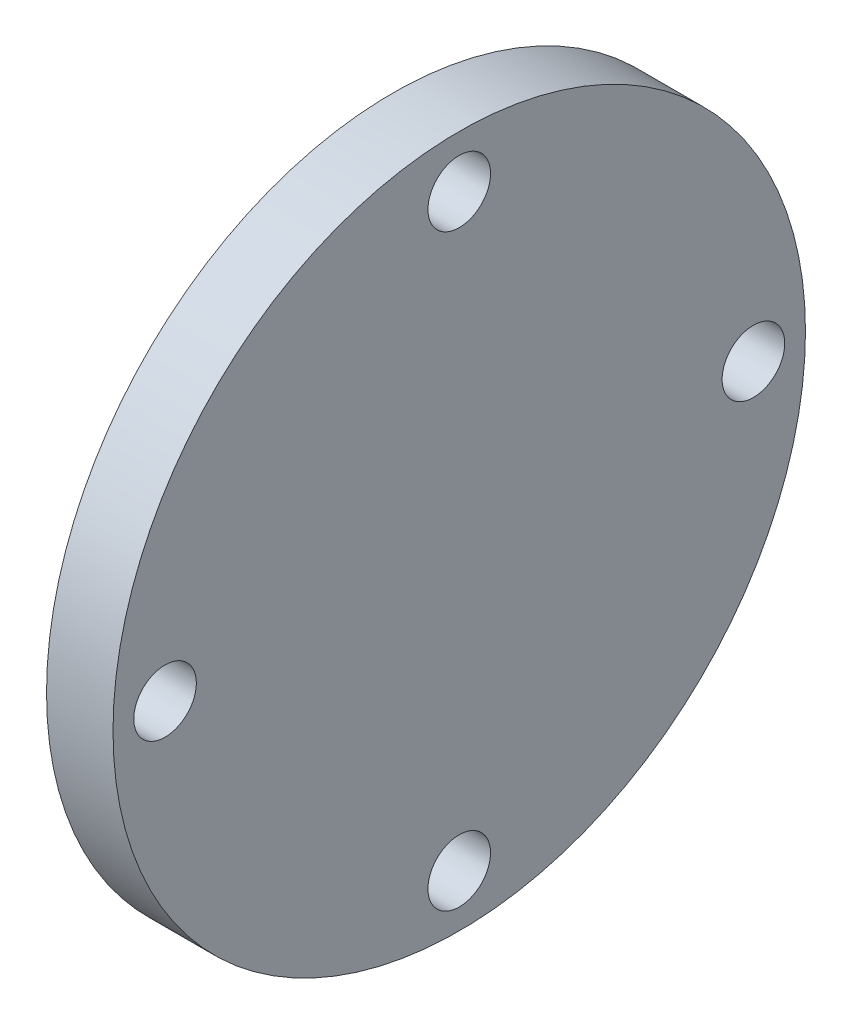
ISO-10303-21;
HEADER;
FILE_DESCRIPTION(('STEP AP214'),'2;1');
FILE_NAME('part.step','',(''),(''),'','','');
FILE_SCHEMA(('AUTOMOTIVE_DESIGN { 1 0 10303 214 1 1 1 1 }'));
ENDSEC;
DATA;
#1=APPLICATION_CONTEXT('core data for automotive mechanical design processes');
#2=APPLICATION_PROTOCOL_DEFINITION('international standard','automotive_design',2000,#1);
#3=PRODUCT_CONTEXT('',#1,'mechanical');
#4=PRODUCT('Part','Part','',(#3));
#5=PRODUCT_RELATED_PRODUCT_CATEGORY('part','',(#4));
#6=PRODUCT_DEFINITION_FORMATION('','',#4);
#7=PRODUCT_DEFINITION_CONTEXT('part definition',#1,'design');
#8=PRODUCT_DEFINITION('design','',#6,#7);
#9=PRODUCT_DEFINITION_SHAPE('','',#8);
#10=(LENGTH_UNIT() NAMED_UNIT(*) SI_UNIT(.MILLI.,.METRE.));
#11=(NAMED_UNIT(*) PLANE_ANGLE_UNIT() SI_UNIT($,.RADIAN.));
#12=(NAMED_UNIT(*) SI_UNIT($,.STERADIAN.) SOLID_ANGLE_UNIT());
#13=UNCERTAINTY_MEASURE_WITH_UNIT(LENGTH_MEASURE(1.E-05),#10,'distance_accuracy_value','');
#14=(GEOMETRIC_REPRESENTATION_CONTEXT(3) GLOBAL_UNCERTAINTY_ASSIGNED_CONTEXT((#13)) GLOBAL_UNIT_ASSIGNED_CONTEXT((#10,
#11,#12)) REPRESENTATION_CONTEXT('',''));
#15=CARTESIAN_POINT('',(0.,0.,0.));
#16=DIRECTION('',(0.,0.,1.));
#17=DIRECTION('',(1.,0.,0.));
#18=AXIS2_PLACEMENT_3D('',#15,#16,#17);
#19=CARTESIAN_POINT('',(0.,0.,0.));
#20=DIRECTION('',(1.,0.,0.));
#21=DIRECTION('',(0.,0.,-1.));
#22=AXIS2_PLACEMENT_3D('',#19,#20,#21);
#23=PLANE('',#22);
#24=CARTESIAN_POINT('',(0.,0.,13.4874));
#25=DIRECTION('',(1.,0.,0.));
#26=DIRECTION('',(0.,0.,-1.));
#27=AXIS2_PLACEMENT_3D('',#24,#25,#26);
#28=CIRCLE('',#27,1.4351);
#29=CARTESIAN_POINT('',(0.,0.,12.0523));
#30=VERTEX_POINT('',#29);
#31=EDGE_CURVE('E68',#30,#30,#28,.T.);
#32=ORIENTED_EDGE('',*,*,#31,.F.);
#33=EDGE_LOOP('',(#32));
#34=FACE_BOUND('',#33,.T.);
#35=CARTESIAN_POINT('',(0.,-13.4874,0.));
#36=DIRECTION('',(1.,0.,0.));
#37=DIRECTION('',(0.,0.,-1.));
#38=AXIS2_PLACEMENT_3D('',#35,#36,#37);
#39=CIRCLE('',#38,1.4351);
#40=CARTESIAN_POINT('',(0.,-13.4874,-1.4351));
#41=VERTEX_POINT('',#40);
#42=EDGE_CURVE('E58',#41,#41,#39,.T.);
#43=ORIENTED_EDGE('',*,*,#42,.F.);
#44=EDGE_LOOP('',(#43));
#45=FACE_BOUND('',#44,.T.);
#46=CARTESIAN_POINT('',(0.,0.,-13.4874));
#47=DIRECTION('',(1.,0.,0.));
#48=DIRECTION('',(0.,0.,-1.));
#49=AXIS2_PLACEMENT_3D('',#46,#47,#48);
#50=CIRCLE('',#49,1.4351);
#51=CARTESIAN_POINT('',(0.,0.,-14.9225));
#52=VERTEX_POINT('',#51);
#53=EDGE_CURVE('E55',#52,#52,#50,.T.);
#54=ORIENTED_EDGE('',*,*,#53,.F.);
#55=EDGE_LOOP('',(#54));
#56=FACE_BOUND('',#55,.T.);
#57=CARTESIAN_POINT('',(0.,13.4874,0.));
#58=DIRECTION('',(1.,0.,0.));
#59=DIRECTION('',(0.,0.,-1.));
#60=AXIS2_PLACEMENT_3D('',#57,#58,#59);
#61=CIRCLE('',#60,1.4351);
#62=CARTESIAN_POINT('',(0.,13.4874,-1.4351));
#63=VERTEX_POINT('',#62);
#64=EDGE_CURVE('E52',#63,#63,#61,.T.);
#65=ORIENTED_EDGE('',*,*,#64,.F.);
#66=EDGE_LOOP('',(#65));
#67=FACE_BOUND('',#66,.T.);
#68=CARTESIAN_POINT('',(0.,0.,0.));
#69=DIRECTION('',(1.,0.,0.));
#70=DIRECTION('',(0.,0.,-1.));
#71=AXIS2_PLACEMENT_3D('',#68,#69,#70);
#72=CIRCLE('',#71,15.875);
#73=CARTESIAN_POINT('',(0.,0.,-15.875));
#74=VERTEX_POINT('',#73);
#75=EDGE_CURVE('E10',#74,#74,#72,.T.);
#76=ORIENTED_EDGE('',*,*,#75,.T.);
#77=EDGE_LOOP('',(#76));
#78=FACE_BOUND('',#77,.T.);
#79=ADVANCED_FACE('F32',(#34,#45,#56,#67,#78),#23,.T.);
#80=CARTESIAN_POINT('',(0.,0.,0.));
#81=DIRECTION('',(1.,0.,0.));
#82=DIRECTION('',(0.,0.,-1.));
#83=AXIS2_PLACEMENT_3D('',#80,#81,#82);
#84=CYLINDRICAL_SURFACE('',#83,15.875);
#85=CARTESIAN_POINT('',(-3.048,0.,0.));
#86=DIRECTION('',(1.,0.,0.));
#87=DIRECTION('',(0.,0.,-1.));
#88=AXIS2_PLACEMENT_3D('',#85,#86,#87);
#89=CIRCLE('',#88,15.875);
#90=CARTESIAN_POINT('',(-3.048,0.,-15.875));
#91=VERTEX_POINT('',#90);
#92=EDGE_CURVE('E39',#91,#91,#89,.T.);
#93=ORIENTED_EDGE('',*,*,#92,.T.);
#94=EDGE_LOOP('',(#93));
#95=FACE_BOUND('',#94,.T.);
#96=ORIENTED_EDGE('',*,*,#75,.F.);
#97=EDGE_LOOP('',(#96));
#98=FACE_BOUND('',#97,.T.);
#99=ADVANCED_FACE('F92',(#95,#98),#84,.T.);
#100=CARTESIAN_POINT('',(-3.048,15.875,0.));
#101=DIRECTION('',(-1.,0.,0.));
#102=DIRECTION('',(0.,0.,1.));
#103=AXIS2_PLACEMENT_3D('',#100,#101,#102);
#104=PLANE('',#103);
#105=CARTESIAN_POINT('',(-3.048,0.,13.4874));
#106=DIRECTION('',(-1.,0.,0.));
#107=DIRECTION('',(0.,0.,1.));
#108=AXIS2_PLACEMENT_3D('',#105,#106,#107);
#109=CIRCLE('',#108,1.4351);
#110=CARTESIAN_POINT('',(-3.048,0.,14.9225));
#111=VERTEX_POINT('',#110);
#112=EDGE_CURVE('E35',#111,#111,#109,.T.);
#113=ORIENTED_EDGE('',*,*,#112,.F.);
#114=EDGE_LOOP('',(#113));
#115=FACE_BOUND('',#114,.T.);
#116=CARTESIAN_POINT('',(-3.048,-13.4874,0.));
#117=DIRECTION('',(-1.,0.,0.));
#118=DIRECTION('',(0.,0.,1.));
#119=AXIS2_PLACEMENT_3D('',#116,#117,#118);
#120=CIRCLE('',#119,1.4351);
#121=CARTESIAN_POINT('',(-3.048,-13.4874,1.4351));
#122=VERTEX_POINT('',#121);
#123=EDGE_CURVE('E56',#122,#122,#120,.T.);
#124=ORIENTED_EDGE('',*,*,#123,.F.);
#125=EDGE_LOOP('',(#124));
#126=FACE_BOUND('',#125,.T.);
#127=CARTESIAN_POINT('',(-3.048,0.,-13.4874));
#128=DIRECTION('',(-1.,0.,0.));
#129=DIRECTION('',(0.,0.,1.));
#130=AXIS2_PLACEMENT_3D('',#127,#128,#129);
#131=CIRCLE('',#130,1.4351);
#132=CARTESIAN_POINT('',(-3.048,0.,-12.0523));
#133=VERTEX_POINT('',#132);
#134=EDGE_CURVE('E53',#133,#133,#131,.T.);
#135=ORIENTED_EDGE('',*,*,#134,.F.);
#136=EDGE_LOOP('',(#135));
#137=FACE_BOUND('',#136,.T.);
#138=CARTESIAN_POINT('',(-3.048,13.4874,0.));
#139=DIRECTION('',(-1.,0.,0.));
#140=DIRECTION('',(0.,0.,1.));
#141=AXIS2_PLACEMENT_3D('',#138,#139,#140);
#142=CIRCLE('',#141,1.4351);
#143=CARTESIAN_POINT('',(-3.048,13.4874,1.4351));
#144=VERTEX_POINT('',#143);
#145=EDGE_CURVE('E48',#144,#144,#142,.T.);
#146=ORIENTED_EDGE('',*,*,#145,.F.);
#147=EDGE_LOOP('',(#146));
#148=FACE_BOUND('',#147,.T.);
#149=CARTESIAN_POINT('',(-3.048,0.,0.));
#150=DIRECTION('',(1.,0.,0.));
#151=DIRECTION('',(0.,0.,-1.));
#152=AXIS2_PLACEMENT_3D('',#149,#150,#151);
#153=CIRCLE('',#152,11.1125);
#154=CARTESIAN_POINT('',(-3.048,0.,-11.1125));
#155=VERTEX_POINT('',#154);
#156=EDGE_CURVE('E44',#155,#155,#153,.T.);
#157=ORIENTED_EDGE('',*,*,#156,.T.);
#158=EDGE_LOOP('',(#157));
#159=FACE_BOUND('',#158,.T.);
#160=ORIENTED_EDGE('',*,*,#92,.F.);
#161=EDGE_LOOP('',(#160));
#162=FACE_BOUND('',#161,.T.);
#163=ADVANCED_FACE('F77',(#115,#126,#137,#148,#159,#162),#104,.T.);
#164=CARTESIAN_POINT('',(0.,0.,0.));
#165=DIRECTION('',(1.,0.,0.));
#166=DIRECTION('',(0.,0.,-1.));
#167=AXIS2_PLACEMENT_3D('',#164,#165,#166);
#168=CYLINDRICAL_SURFACE('',#167,11.1125);
#169=CARTESIAN_POINT('',(-5.334,0.,0.));
#170=DIRECTION('',(1.,0.,0.));
#171=DIRECTION('',(0.,0.,-1.));
#172=AXIS2_PLACEMENT_3D('',#169,#170,#171);
#173=CIRCLE('',#172,11.1125);
#174=CARTESIAN_POINT('',(-5.334,0.,-11.1125));
#175=VERTEX_POINT('',#174);
#176=EDGE_CURVE('E51',#175,#175,#173,.T.);
#177=ORIENTED_EDGE('',*,*,#176,.T.);
#178=EDGE_LOOP('',(#177));
#179=FACE_BOUND('',#178,.T.);
#180=ORIENTED_EDGE('',*,*,#156,.F.);
#181=EDGE_LOOP('',(#180));
#182=FACE_BOUND('',#181,.T.);
#183=ADVANCED_FACE('F80',(#179,#182),#168,.T.);
#184=CARTESIAN_POINT('',(-5.334,11.1125,0.));
#185=DIRECTION('',(-1.,0.,0.));
#186=DIRECTION('',(0.,0.,1.));
#187=AXIS2_PLACEMENT_3D('',#184,#185,#186);
#188=PLANE('',#187);
#189=ORIENTED_EDGE('',*,*,#176,.F.);
#190=EDGE_LOOP('',(#189));
#191=FACE_BOUND('',#190,.T.);
#192=ADVANCED_FACE('F82',(#191),#188,.T.);
#193=CARTESIAN_POINT('',(-5.334,13.4874,0.));
#194=DIRECTION('',(1.,0.,0.));
#195=DIRECTION('',(0.,0.,-1.));
#196=AXIS2_PLACEMENT_3D('',#193,#194,#195);
#197=CYLINDRICAL_SURFACE('',#196,1.4351);
#198=ORIENTED_EDGE('',*,*,#145,.T.);
#199=EDGE_LOOP('',(#198));
#200=FACE_BOUND('',#199,.T.);
#201=ORIENTED_EDGE('',*,*,#64,.T.);
#202=EDGE_LOOP('',(#201));
#203=FACE_BOUND('',#202,.T.);
#204=ADVANCED_FACE('F89',(#200,#203),#197,.F.);
#205=CARTESIAN_POINT('',(-5.334,0.,-13.4874));
#206=DIRECTION('',(1.,0.,0.));
#207=DIRECTION('',(0.,0.,-1.));
#208=AXIS2_PLACEMENT_3D('',#205,#206,#207);
#209=CYLINDRICAL_SURFACE('',#208,1.4351);
#210=ORIENTED_EDGE('',*,*,#134,.T.);
#211=EDGE_LOOP('',(#210));
#212=FACE_BOUND('',#211,.T.);
#213=ORIENTED_EDGE('',*,*,#53,.T.);
#214=EDGE_LOOP('',(#213));
#215=FACE_BOUND('',#214,.T.);
#216=ADVANCED_FACE('F110',(#212,#215),#209,.F.);
#217=CARTESIAN_POINT('',(-5.334,-13.4874,0.));
#218=DIRECTION('',(1.,0.,0.));
#219=DIRECTION('',(0.,0.,-1.));
#220=AXIS2_PLACEMENT_3D('',#217,#218,#219);
#221=CYLINDRICAL_SURFACE('',#220,1.4351);
#222=ORIENTED_EDGE('',*,*,#123,.T.);
#223=EDGE_LOOP('',(#222));
#224=FACE_BOUND('',#223,.T.);
#225=ORIENTED_EDGE('',*,*,#42,.T.);
#226=EDGE_LOOP('',(#225));
#227=FACE_BOUND('',#226,.T.);
#228=ADVANCED_FACE('F116',(#224,#227),#221,.F.);
#229=CARTESIAN_POINT('',(-5.334,0.,13.4874));
#230=DIRECTION('',(1.,0.,0.));
#231=DIRECTION('',(0.,0.,-1.));
#232=AXIS2_PLACEMENT_3D('',#229,#230,#231);
#233=CYLINDRICAL_SURFACE('',#232,1.4351);
#234=ORIENTED_EDGE('',*,*,#112,.T.);
#235=EDGE_LOOP('',(#234));
#236=FACE_BOUND('',#235,.T.);
#237=ORIENTED_EDGE('',*,*,#31,.T.);
#238=EDGE_LOOP('',(#237));
#239=FACE_BOUND('',#238,.T.);
#240=ADVANCED_FACE('F122',(#236,#239),#233,.F.);
#241=CLOSED_SHELL('',(#79,#99,#163,#183,#192,#204,#216,#228,#240));
#242=MANIFOLD_SOLID_BREP('B2',#241);
#243=ADVANCED_BREP_SHAPE_REPRESENTATION('',(#18,#242),#14);
#244=SHAPE_DEFINITION_REPRESENTATION(#9,#243);
ENDSEC;
END-ISO-10303-21;
